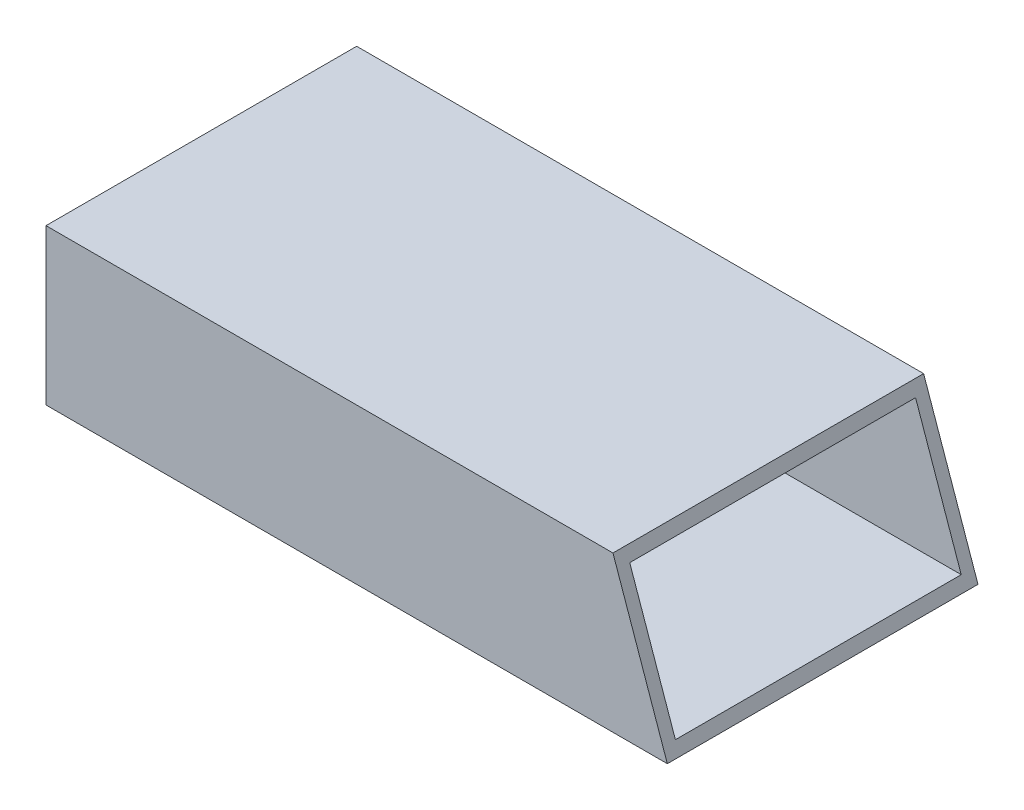
ISO-10303-21;
HEADER;
FILE_DESCRIPTION(('STEP AP214'),'2;1');
FILE_NAME('part.step','',(''),(''),'','','');
FILE_SCHEMA(('AUTOMOTIVE_DESIGN { 1 0 10303 214 1 1 1 1 }'));
ENDSEC;
DATA;
#1=APPLICATION_CONTEXT('core data for automotive mechanical design processes');
#2=APPLICATION_PROTOCOL_DEFINITION('international standard','automotive_design',2000,#1);
#3=PRODUCT_CONTEXT('',#1,'mechanical');
#4=PRODUCT('Part','Part','',(#3));
#5=PRODUCT_RELATED_PRODUCT_CATEGORY('part','',(#4));
#6=PRODUCT_DEFINITION_FORMATION('','',#4);
#7=PRODUCT_DEFINITION_CONTEXT('part definition',#1,'design');
#8=PRODUCT_DEFINITION('design','',#6,#7);
#9=PRODUCT_DEFINITION_SHAPE('','',#8);
#10=(LENGTH_UNIT() NAMED_UNIT(*) SI_UNIT(.MILLI.,.METRE.));
#11=(NAMED_UNIT(*) PLANE_ANGLE_UNIT() SI_UNIT($,.RADIAN.));
#12=(NAMED_UNIT(*) SI_UNIT($,.STERADIAN.) SOLID_ANGLE_UNIT());
#13=UNCERTAINTY_MEASURE_WITH_UNIT(LENGTH_MEASURE(1.E-05),#10,'distance_accuracy_value','');
#14=(GEOMETRIC_REPRESENTATION_CONTEXT(3) GLOBAL_UNCERTAINTY_ASSIGNED_CONTEXT((#13)) GLOBAL_UNIT_ASSIGNED_CONTEXT((#10,
#11,#12)) REPRESENTATION_CONTEXT('',''));
#15=CARTESIAN_POINT('',(0.,0.,0.));
#16=DIRECTION('',(0.,0.,1.));
#17=DIRECTION('',(1.,0.,0.));
#18=AXIS2_PLACEMENT_3D('',#15,#16,#17);
#19=CARTESIAN_POINT('',(0.,50.,100.));
#20=DIRECTION('',(1.,0.,0.));
#21=DIRECTION('',(0.,1.,0.));
#22=AXIS2_PLACEMENT_3D('',#19,#20,#21);
#23=PLANE('',#22);
#24=DIRECTION('',(0.,0.,1.));
#25=VECTOR('',#24,1.);
#26=CARTESIAN_POINT('',(0.,4.,4.00000000000001));
#27=LINE('',#26,#25);
#28=CARTESIAN_POINT('',(0.,4.,4.));
#29=VERTEX_POINT('',#28);
#30=CARTESIAN_POINT('',(0.,4.,96.));
#31=VERTEX_POINT('',#30);
#32=EDGE_CURVE('E116',#29,#31,#27,.T.);
#33=ORIENTED_EDGE('',*,*,#32,.F.);
#34=DIRECTION('',(0.,-1.,0.));
#35=VECTOR('',#34,1.);
#36=CARTESIAN_POINT('',(0.,46.,4.));
#37=LINE('',#36,#35);
#38=CARTESIAN_POINT('',(0.,46.,4.));
#39=VERTEX_POINT('',#38);
#40=EDGE_CURVE('E54',#39,#29,#37,.T.);
#41=ORIENTED_EDGE('',*,*,#40,.F.);
#42=DIRECTION('',(0.,0.,-1.));
#43=VECTOR('',#42,1.);
#44=CARTESIAN_POINT('',(0.,46.,96.));
#45=LINE('',#44,#43);
#46=CARTESIAN_POINT('',(0.,46.,96.));
#47=VERTEX_POINT('',#46);
#48=EDGE_CURVE('E122',#47,#39,#45,.T.);
#49=ORIENTED_EDGE('',*,*,#48,.F.);
#50=DIRECTION('',(0.,1.,0.));
#51=VECTOR('',#50,1.);
#52=CARTESIAN_POINT('',(0.,4.,96.));
#53=LINE('',#52,#51);
#54=EDGE_CURVE('E107',#31,#47,#53,.T.);
#55=ORIENTED_EDGE('',*,*,#54,.F.);
#56=EDGE_LOOP('',(#33,#41,#49,#55));
#57=FACE_BOUND('',#56,.T.);
#58=DIRECTION('',(0.,-1.,0.));
#59=VECTOR('',#58,1.);
#60=CARTESIAN_POINT('',(0.,50.,0.));
#61=LINE('',#60,#59);
#62=CARTESIAN_POINT('',(0.,50.,0.));
#63=VERTEX_POINT('',#62);
#64=CARTESIAN_POINT('',(0.,0.,0.));
#65=VERTEX_POINT('',#64);
#66=EDGE_CURVE('E129',#63,#65,#61,.T.);
#67=ORIENTED_EDGE('',*,*,#66,.T.);
#68=DIRECTION('',(0.,0.,-1.));
#69=VECTOR('',#68,1.);
#70=CARTESIAN_POINT('',(0.,0.,100.));
#71=LINE('',#70,#69);
#72=CARTESIAN_POINT('',(0.,0.,100.));
#73=VERTEX_POINT('',#72);
#74=EDGE_CURVE('E158',#73,#65,#71,.T.);
#75=ORIENTED_EDGE('',*,*,#74,.F.);
#76=DIRECTION('',(0.,-1.,0.));
#77=VECTOR('',#76,1.);
#78=CARTESIAN_POINT('',(0.,50.,100.));
#79=LINE('',#78,#77);
#80=CARTESIAN_POINT('',(0.,50.,100.));
#81=VERTEX_POINT('',#80);
#82=EDGE_CURVE('E132',#81,#73,#79,.T.);
#83=ORIENTED_EDGE('',*,*,#82,.F.);
#84=DIRECTION('',(0.,0.,-1.));
#85=VECTOR('',#84,1.);
#86=CARTESIAN_POINT('',(0.,50.,100.));
#87=LINE('',#86,#85);
#88=EDGE_CURVE('E142',#81,#63,#87,.T.);
#89=ORIENTED_EDGE('',*,*,#88,.T.);
#90=EDGE_LOOP('',(#67,#75,#83,#89));
#91=FACE_BOUND('',#90,.T.);
#92=ADVANCED_FACE('F40',(#57,#91),#23,.F.);
#93=CARTESIAN_POINT('',(0.,0.,100.));
#94=DIRECTION('',(0.,1.,0.));
#95=DIRECTION('',(0.,0.,1.));
#96=AXIS2_PLACEMENT_3D('',#93,#94,#95);
#97=PLANE('',#96);
#98=DIRECTION('',(1.,0.,0.));
#99=VECTOR('',#98,1.);
#100=CARTESIAN_POINT('',(0.,0.,0.));
#101=LINE('',#100,#99);
#102=CARTESIAN_POINT('',(200.,0.,0.));
#103=VERTEX_POINT('',#102);
#104=EDGE_CURVE('E145',#65,#103,#101,.T.);
#105=ORIENTED_EDGE('',*,*,#104,.T.);
#106=DIRECTION('',(0.,0.,-1.));
#107=VECTOR('',#106,1.);
#108=CARTESIAN_POINT('',(200.,0.,100.));
#109=LINE('',#108,#107);
#110=CARTESIAN_POINT('',(200.,0.,100.));
#111=VERTEX_POINT('',#110);
#112=EDGE_CURVE('E155',#111,#103,#109,.T.);
#113=ORIENTED_EDGE('',*,*,#112,.F.);
#114=DIRECTION('',(1.,0.,0.));
#115=VECTOR('',#114,1.);
#116=CARTESIAN_POINT('',(0.,0.,100.));
#117=LINE('',#116,#115);
#118=EDGE_CURVE('E135',#73,#111,#117,.T.);
#119=ORIENTED_EDGE('',*,*,#118,.F.);
#120=ORIENTED_EDGE('',*,*,#74,.T.);
#121=EDGE_LOOP('',(#105,#113,#119,#120));
#122=FACE_BOUND('',#121,.T.);
#123=ADVANCED_FACE('F185',(#122),#97,.F.);
#124=CARTESIAN_POINT('',(200.,0.,100.));
#125=DIRECTION('',(-0.943858356366017,-0.330350424728106,0.));
#126=DIRECTION('',(0.330350424728106,-0.943858356366017,0.));
#127=AXIS2_PLACEMENT_3D('',#124,#125,#126);
#128=PLANE('',#127);
#129=DIRECTION('',(0.,0.,-1.));
#130=VECTOR('',#129,1.);
#131=CARTESIAN_POINT('',(183.9,46.,100.));
#132=LINE('',#131,#130);
#133=CARTESIAN_POINT('',(183.9,46.,96.));
#134=VERTEX_POINT('',#133);
#135=CARTESIAN_POINT('',(183.9,46.,4.));
#136=VERTEX_POINT('',#135);
#137=EDGE_CURVE('E47',#134,#136,#132,.T.);
#138=ORIENTED_EDGE('',*,*,#137,.T.);
#139=DIRECTION('',(0.330350424728106,-0.943858356366017,0.));
#140=VECTOR('',#139,1.);
#141=CARTESIAN_POINT('',(200.,0.,4.));
#142=LINE('',#141,#140);
#143=CARTESIAN_POINT('',(198.6,3.99999999999998,4.00000000000001));
#144=VERTEX_POINT('',#143);
#145=EDGE_CURVE('E11',#136,#144,#142,.T.);
#146=ORIENTED_EDGE('',*,*,#145,.T.);
#147=DIRECTION('',(0.,0.,1.));
#148=VECTOR('',#147,1.);
#149=CARTESIAN_POINT('',(198.6,3.99999999999998,100.));
#150=LINE('',#149,#148);
#151=CARTESIAN_POINT('',(198.6,3.99999999999998,96.));
#152=VERTEX_POINT('',#151);
#153=EDGE_CURVE('E161',#144,#152,#150,.T.);
#154=ORIENTED_EDGE('',*,*,#153,.T.);
#155=DIRECTION('',(-0.330350424728106,0.943858356366017,0.));
#156=VECTOR('',#155,1.);
#157=CARTESIAN_POINT('',(200.,0.,96.));
#158=LINE('',#157,#156);
#159=EDGE_CURVE('E110',#152,#134,#158,.T.);
#160=ORIENTED_EDGE('',*,*,#159,.T.);
#161=EDGE_LOOP('',(#138,#146,#154,#160));
#162=FACE_BOUND('',#161,.T.);
#163=DIRECTION('',(-0.330350424728106,0.943858356366017,0.));
#164=VECTOR('',#163,1.);
#165=CARTESIAN_POINT('',(200.,0.,0.));
#166=LINE('',#165,#164);
#167=CARTESIAN_POINT('',(182.5,50.,0.));
#168=VERTEX_POINT('',#167);
#169=EDGE_CURVE('E147',#103,#168,#166,.T.);
#170=ORIENTED_EDGE('',*,*,#169,.T.);
#171=DIRECTION('',(0.,0.,-1.));
#172=VECTOR('',#171,1.);
#173=CARTESIAN_POINT('',(182.5,50.,100.));
#174=LINE('',#173,#172);
#175=CARTESIAN_POINT('',(182.5,50.,100.));
#176=VERTEX_POINT('',#175);
#177=EDGE_CURVE('E152',#176,#168,#174,.T.);
#178=ORIENTED_EDGE('',*,*,#177,.F.);
#179=DIRECTION('',(-0.330350424728106,0.943858356366017,0.));
#180=VECTOR('',#179,1.);
#181=CARTESIAN_POINT('',(200.,0.,100.));
#182=LINE('',#181,#180);
#183=EDGE_CURVE('E138',#111,#176,#182,.T.);
#184=ORIENTED_EDGE('',*,*,#183,.F.);
#185=ORIENTED_EDGE('',*,*,#112,.T.);
#186=EDGE_LOOP('',(#170,#178,#184,#185));
#187=FACE_BOUND('',#186,.T.);
#188=ADVANCED_FACE('F165',(#162,#187),#128,.F.);
#189=CARTESIAN_POINT('',(0.,50.,100.));
#190=DIRECTION('',(0.,-1.,0.));
#191=DIRECTION('',(0.,0.,-1.));
#192=AXIS2_PLACEMENT_3D('',#189,#190,#191);
#193=PLANE('',#192);
#194=DIRECTION('',(-1.,0.,0.));
#195=VECTOR('',#194,1.);
#196=CARTESIAN_POINT('',(0.,50.,0.));
#197=LINE('',#196,#195);
#198=EDGE_CURVE('E136',#168,#63,#197,.T.);
#199=ORIENTED_EDGE('',*,*,#198,.T.);
#200=ORIENTED_EDGE('',*,*,#88,.F.);
#201=DIRECTION('',(-1.,0.,0.));
#202=VECTOR('',#201,1.);
#203=CARTESIAN_POINT('',(0.,50.,100.));
#204=LINE('',#203,#202);
#205=EDGE_CURVE('E140',#176,#81,#204,.T.);
#206=ORIENTED_EDGE('',*,*,#205,.F.);
#207=ORIENTED_EDGE('',*,*,#177,.T.);
#208=EDGE_LOOP('',(#199,#200,#206,#207));
#209=FACE_BOUND('',#208,.T.);
#210=ADVANCED_FACE('F193',(#209),#193,.F.);
#211=CARTESIAN_POINT('',(0.,0.,100.));
#212=DIRECTION('',(0.,0.,1.));
#213=DIRECTION('',(1.,0.,0.));
#214=AXIS2_PLACEMENT_3D('',#211,#212,#213);
#215=PLANE('',#214);
#216=ORIENTED_EDGE('',*,*,#82,.T.);
#217=ORIENTED_EDGE('',*,*,#118,.T.);
#218=ORIENTED_EDGE('',*,*,#183,.T.);
#219=ORIENTED_EDGE('',*,*,#205,.T.);
#220=EDGE_LOOP('',(#216,#217,#218,#219));
#221=FACE_BOUND('',#220,.T.);
#222=ADVANCED_FACE('F179',(#221),#215,.T.);
#223=CARTESIAN_POINT('',(0.,0.,0.));
#224=DIRECTION('',(0.,0.,1.));
#225=DIRECTION('',(1.,0.,0.));
#226=AXIS2_PLACEMENT_3D('',#223,#224,#225);
#227=PLANE('',#226);
#228=ORIENTED_EDGE('',*,*,#66,.F.);
#229=ORIENTED_EDGE('',*,*,#198,.F.);
#230=ORIENTED_EDGE('',*,*,#169,.F.);
#231=ORIENTED_EDGE('',*,*,#104,.F.);
#232=EDGE_LOOP('',(#228,#229,#230,#231));
#233=FACE_BOUND('',#232,.T.);
#234=ADVANCED_FACE('F172',(#233),#227,.F.);
#235=CARTESIAN_POINT('',(200.,46.,4.));
#236=DIRECTION('',(0.,0.,-1.));
#237=DIRECTION('',(0.,1.,0.));
#238=AXIS2_PLACEMENT_3D('',#235,#236,#237);
#239=PLANE('',#238);
#240=DIRECTION('',(-1.,0.,0.));
#241=VECTOR('',#240,1.);
#242=CARTESIAN_POINT('',(200.,46.,4.));
#243=LINE('',#242,#241);
#244=EDGE_CURVE('E127',#136,#39,#243,.T.);
#245=ORIENTED_EDGE('',*,*,#244,.T.);
#246=ORIENTED_EDGE('',*,*,#40,.T.);
#247=DIRECTION('',(-1.,0.,0.));
#248=VECTOR('',#247,1.);
#249=CARTESIAN_POINT('',(200.,3.99999999999998,4.00000000000001));
#250=LINE('',#249,#248);
#251=EDGE_CURVE('E113',#144,#29,#250,.T.);
#252=ORIENTED_EDGE('',*,*,#251,.F.);
#253=ORIENTED_EDGE('',*,*,#145,.F.);
#254=EDGE_LOOP('',(#245,#246,#252,#253));
#255=FACE_BOUND('',#254,.T.);
#256=ADVANCED_FACE('F170',(#255),#239,.F.);
#257=CARTESIAN_POINT('',(200.,46.,96.));
#258=DIRECTION('',(0.,1.,0.));
#259=DIRECTION('',(0.,0.,1.));
#260=AXIS2_PLACEMENT_3D('',#257,#258,#259);
#261=PLANE('',#260);
#262=DIRECTION('',(-1.,0.,0.));
#263=VECTOR('',#262,1.);
#264=CARTESIAN_POINT('',(200.,46.,96.));
#265=LINE('',#264,#263);
#266=EDGE_CURVE('E112',#134,#47,#265,.T.);
#267=ORIENTED_EDGE('',*,*,#266,.T.);
#268=ORIENTED_EDGE('',*,*,#48,.T.);
#269=ORIENTED_EDGE('',*,*,#244,.F.);
#270=ORIENTED_EDGE('',*,*,#137,.F.);
#271=EDGE_LOOP('',(#267,#268,#269,#270));
#272=FACE_BOUND('',#271,.T.);
#273=ADVANCED_FACE('F169',(#272),#261,.F.);
#274=CARTESIAN_POINT('',(200.,3.99999999999998,96.));
#275=DIRECTION('',(0.,0.,1.));
#276=DIRECTION('',(1.,0.,0.));
#277=AXIS2_PLACEMENT_3D('',#274,#275,#276);
#278=PLANE('',#277);
#279=DIRECTION('',(-1.,0.,0.));
#280=VECTOR('',#279,1.);
#281=CARTESIAN_POINT('',(200.,3.99999999999998,96.));
#282=LINE('',#281,#280);
#283=EDGE_CURVE('E62',#152,#31,#282,.T.);
#284=ORIENTED_EDGE('',*,*,#283,.T.);
#285=ORIENTED_EDGE('',*,*,#54,.T.);
#286=ORIENTED_EDGE('',*,*,#266,.F.);
#287=ORIENTED_EDGE('',*,*,#159,.F.);
#288=EDGE_LOOP('',(#284,#285,#286,#287));
#289=FACE_BOUND('',#288,.T.);
#290=ADVANCED_FACE('F104',(#289),#278,.F.);
#291=CARTESIAN_POINT('',(200.,3.99999999999998,4.00000000000001));
#292=DIRECTION('',(0.,-1.,0.));
#293=DIRECTION('',(1.,0.,0.));
#294=AXIS2_PLACEMENT_3D('',#291,#292,#293);
#295=PLANE('',#294);
#296=ORIENTED_EDGE('',*,*,#251,.T.);
#297=ORIENTED_EDGE('',*,*,#32,.T.);
#298=ORIENTED_EDGE('',*,*,#283,.F.);
#299=ORIENTED_EDGE('',*,*,#153,.F.);
#300=EDGE_LOOP('',(#296,#297,#298,#299));
#301=FACE_BOUND('',#300,.T.);
#302=ADVANCED_FACE('F117',(#301),#295,.F.);
#303=CLOSED_SHELL('',(#92,#123,#188,#210,#222,#234,#256,#273,#290,#302));
#304=MANIFOLD_SOLID_BREP('B2',#303);
#305=ADVANCED_BREP_SHAPE_REPRESENTATION('',(#18,#304),#14);
#306=SHAPE_DEFINITION_REPRESENTATION(#9,#305);
ENDSEC;
END-ISO-10303-21;
